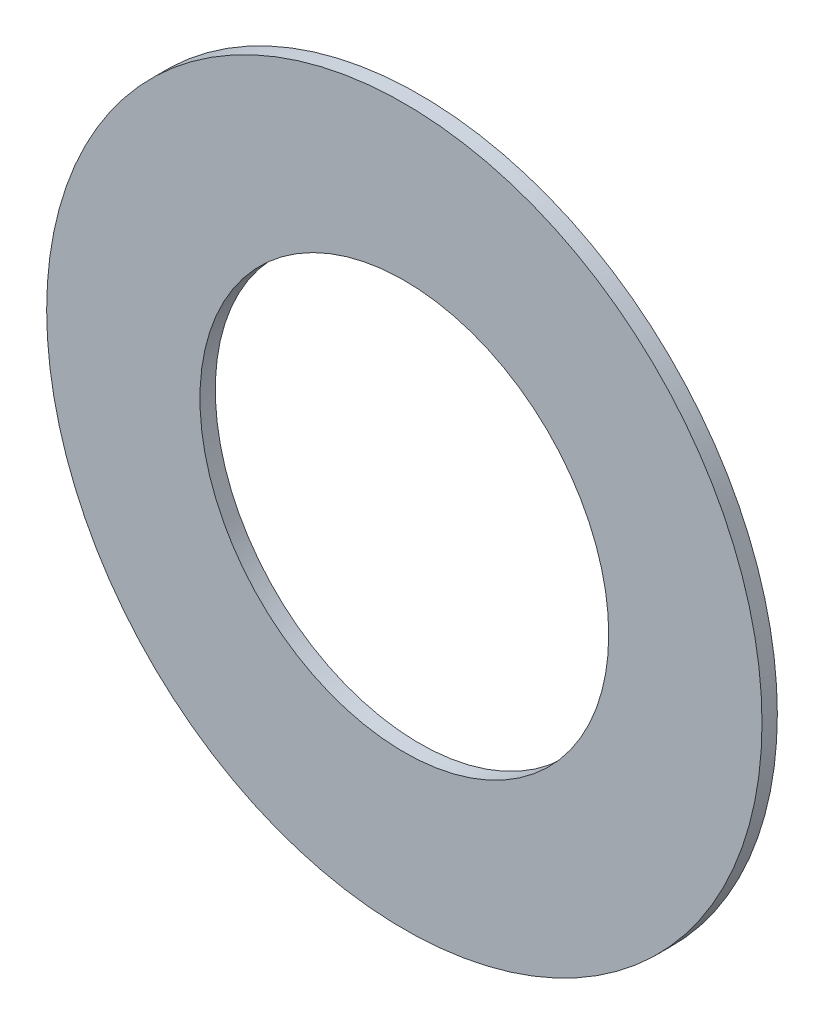
ISO-10303-21;
HEADER;
FILE_DESCRIPTION(('STEP AP214'),'2;1');
FILE_NAME('part.step','',(''),(''),'','','');
FILE_SCHEMA(('AUTOMOTIVE_DESIGN { 1 0 10303 214 1 1 1 1 }'));
ENDSEC;
DATA;
#1=APPLICATION_CONTEXT('core data for automotive mechanical design processes');
#2=APPLICATION_PROTOCOL_DEFINITION('international standard','automotive_design',2000,#1);
#3=PRODUCT_CONTEXT('',#1,'mechanical');
#4=PRODUCT('Part','Part','',(#3));
#5=PRODUCT_RELATED_PRODUCT_CATEGORY('part','',(#4));
#6=PRODUCT_DEFINITION_FORMATION('','',#4);
#7=PRODUCT_DEFINITION_CONTEXT('part definition',#1,'design');
#8=PRODUCT_DEFINITION('design','',#6,#7);
#9=PRODUCT_DEFINITION_SHAPE('','',#8);
#10=(LENGTH_UNIT() NAMED_UNIT(*) SI_UNIT(.MILLI.,.METRE.));
#11=(NAMED_UNIT(*) PLANE_ANGLE_UNIT() SI_UNIT($,.RADIAN.));
#12=(NAMED_UNIT(*) SI_UNIT($,.STERADIAN.) SOLID_ANGLE_UNIT());
#13=UNCERTAINTY_MEASURE_WITH_UNIT(LENGTH_MEASURE(1.E-05),#10,'distance_accuracy_value','');
#14=(GEOMETRIC_REPRESENTATION_CONTEXT(3) GLOBAL_UNCERTAINTY_ASSIGNED_CONTEXT((#13)) GLOBAL_UNIT_ASSIGNED_CONTEXT((#10,
#11,#12)) REPRESENTATION_CONTEXT('',''));
#15=CARTESIAN_POINT('',(0.,0.,0.));
#16=DIRECTION('',(0.,0.,1.));
#17=DIRECTION('',(1.,0.,0.));
#18=AXIS2_PLACEMENT_3D('',#15,#16,#17);
#19=CARTESIAN_POINT('',(0.,0.,0.3));
#20=DIRECTION('',(0.,0.,1.));
#21=DIRECTION('',(1.,0.,0.));
#22=AXIS2_PLACEMENT_3D('',#19,#20,#21);
#23=PLANE('',#22);
#24=CARTESIAN_POINT('',(0.,0.,0.3));
#25=DIRECTION('',(0.,0.,1.));
#26=DIRECTION('',(1.,0.,0.));
#27=AXIS2_PLACEMENT_3D('',#24,#25,#26);
#28=CIRCLE('',#27,7.);
#29=CARTESIAN_POINT('',(7.,0.,0.3));
#30=VERTEX_POINT('',#29);
#31=EDGE_CURVE('E10',#30,#30,#28,.T.);
#32=ORIENTED_EDGE('',*,*,#31,.T.);
#33=EDGE_LOOP('',(#32));
#34=FACE_BOUND('',#33,.T.);
#35=CARTESIAN_POINT('',(0.,0.,0.3));
#36=DIRECTION('',(0.,0.,1.));
#37=DIRECTION('',(1.,0.,0.));
#38=AXIS2_PLACEMENT_3D('',#35,#36,#37);
#39=CIRCLE('',#38,4.);
#40=CARTESIAN_POINT('',(4.,0.,0.3));
#41=VERTEX_POINT('',#40);
#42=EDGE_CURVE('E48',#41,#41,#39,.T.);
#43=ORIENTED_EDGE('',*,*,#42,.F.);
#44=EDGE_LOOP('',(#43));
#45=FACE_BOUND('',#44,.T.);
#46=ADVANCED_FACE('F37',(#34,#45),#23,.T.);
#47=CARTESIAN_POINT('',(0.,0.,0.));
#48=DIRECTION('',(0.,0.,1.));
#49=DIRECTION('',(1.,0.,0.));
#50=AXIS2_PLACEMENT_3D('',#47,#48,#49);
#51=PLANE('',#50);
#52=CARTESIAN_POINT('',(0.,0.,0.));
#53=DIRECTION('',(0.,0.,1.));
#54=DIRECTION('',(1.,0.,0.));
#55=AXIS2_PLACEMENT_3D('',#52,#53,#54);
#56=CIRCLE('',#55,7.);
#57=CARTESIAN_POINT('',(7.,0.,0.));
#58=VERTEX_POINT('',#57);
#59=EDGE_CURVE('E41',#58,#58,#56,.T.);
#60=ORIENTED_EDGE('',*,*,#59,.F.);
#61=EDGE_LOOP('',(#60));
#62=FACE_BOUND('',#61,.T.);
#63=CARTESIAN_POINT('',(0.,0.,0.));
#64=DIRECTION('',(0.,0.,1.));
#65=DIRECTION('',(1.,0.,0.));
#66=AXIS2_PLACEMENT_3D('',#63,#64,#65);
#67=CIRCLE('',#66,4.);
#68=CARTESIAN_POINT('',(4.,0.,0.));
#69=VERTEX_POINT('',#68);
#70=EDGE_CURVE('E50',#69,#69,#67,.T.);
#71=ORIENTED_EDGE('',*,*,#70,.T.);
#72=EDGE_LOOP('',(#71));
#73=FACE_BOUND('',#72,.T.);
#74=ADVANCED_FACE('F60',(#62,#73),#51,.F.);
#75=CARTESIAN_POINT('',(0.,0.,0.3));
#76=DIRECTION('',(0.,0.,-1.));
#77=DIRECTION('',(-1.,0.,0.));
#78=AXIS2_PLACEMENT_3D('',#75,#76,#77);
#79=CYLINDRICAL_SURFACE('',#78,7.);
#80=ORIENTED_EDGE('',*,*,#31,.F.);
#81=EDGE_LOOP('',(#80));
#82=FACE_BOUND('',#81,.T.);
#83=ORIENTED_EDGE('',*,*,#59,.T.);
#84=EDGE_LOOP('',(#83));
#85=FACE_BOUND('',#84,.T.);
#86=ADVANCED_FACE('F39',(#82,#85),#79,.T.);
#87=CARTESIAN_POINT('',(0.,0.,0.3));
#88=DIRECTION('',(0.,0.,-1.));
#89=DIRECTION('',(-1.,0.,0.));
#90=AXIS2_PLACEMENT_3D('',#87,#88,#89);
#91=CYLINDRICAL_SURFACE('',#90,4.);
#92=ORIENTED_EDGE('',*,*,#42,.T.);
#93=EDGE_LOOP('',(#92));
#94=FACE_BOUND('',#93,.T.);
#95=ORIENTED_EDGE('',*,*,#70,.F.);
#96=EDGE_LOOP('',(#95));
#97=FACE_BOUND('',#96,.T.);
#98=ADVANCED_FACE('F56',(#94,#97),#91,.F.);
#99=CLOSED_SHELL('',(#46,#74,#86,#98));
#100=MANIFOLD_SOLID_BREP('B2',#99);
#101=ADVANCED_BREP_SHAPE_REPRESENTATION('',(#18,#100),#14);
#102=SHAPE_DEFINITION_REPRESENTATION(#9,#101);
ENDSEC;
END-ISO-10303-21;
